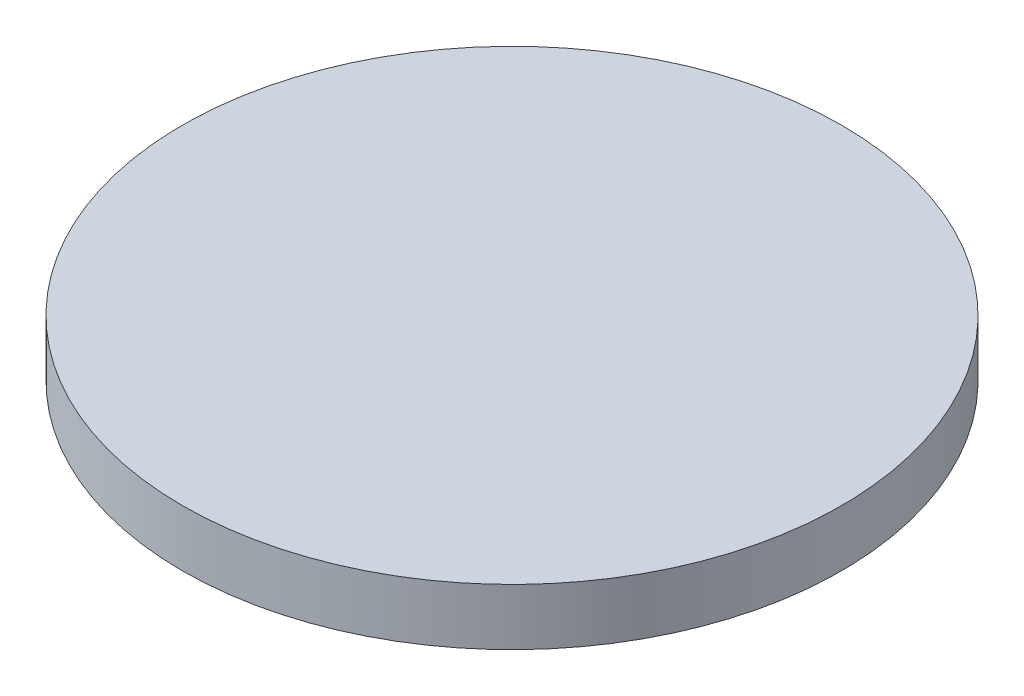
ISO-10303-21;
HEADER;
FILE_DESCRIPTION(('STEP AP214'),'2;1');
FILE_NAME('part.step','',(''),(''),'','','');
FILE_SCHEMA(('AUTOMOTIVE_DESIGN { 1 0 10303 214 1 1 1 1 }'));
ENDSEC;
DATA;
#1=APPLICATION_CONTEXT('core data for automotive mechanical design processes');
#2=APPLICATION_PROTOCOL_DEFINITION('international standard','automotive_design',2000,#1);
#3=PRODUCT_CONTEXT('',#1,'mechanical');
#4=PRODUCT('Part','Part','',(#3));
#5=PRODUCT_RELATED_PRODUCT_CATEGORY('part','',(#4));
#6=PRODUCT_DEFINITION_FORMATION('','',#4);
#7=PRODUCT_DEFINITION_CONTEXT('part definition',#1,'design');
#8=PRODUCT_DEFINITION('design','',#6,#7);
#9=PRODUCT_DEFINITION_SHAPE('','',#8);
#10=(LENGTH_UNIT() NAMED_UNIT(*) SI_UNIT(.MILLI.,.METRE.));
#11=(NAMED_UNIT(*) PLANE_ANGLE_UNIT() SI_UNIT($,.RADIAN.));
#12=(NAMED_UNIT(*) SI_UNIT($,.STERADIAN.) SOLID_ANGLE_UNIT());
#13=UNCERTAINTY_MEASURE_WITH_UNIT(LENGTH_MEASURE(1.E-05),#10,'distance_accuracy_value','');
#14=(GEOMETRIC_REPRESENTATION_CONTEXT(3) GLOBAL_UNCERTAINTY_ASSIGNED_CONTEXT((#13)) GLOBAL_UNIT_ASSIGNED_CONTEXT((#10,
#11,#12)) REPRESENTATION_CONTEXT('',''));
#15=CARTESIAN_POINT('',(0.,0.,0.));
#16=DIRECTION('',(0.,0.,1.));
#17=DIRECTION('',(1.,0.,0.));
#18=AXIS2_PLACEMENT_3D('',#15,#16,#17);
#19=CARTESIAN_POINT('',(0.,0.762,0.));
#20=DIRECTION('',(0.,-1.,0.));
#21=DIRECTION('',(0.,0.,-1.));
#22=AXIS2_PLACEMENT_3D('',#19,#20,#21);
#23=CYLINDRICAL_SURFACE('',#22,4.445);
#24=CARTESIAN_POINT('',(0.,0.762,0.));
#25=DIRECTION('',(0.,1.,0.));
#26=DIRECTION('',(0.,0.,1.));
#27=AXIS2_PLACEMENT_3D('',#24,#25,#26);
#28=CIRCLE('',#27,4.445);
#29=CARTESIAN_POINT('',(0.,0.762,-4.445));
#30=VERTEX_POINT('',#29);
#31=EDGE_CURVE('E10',#30,#30,#28,.T.);
#32=CARTESIAN_POINT('',(0.,0.,0.));
#33=DIRECTION('',(0.,1.,0.));
#34=DIRECTION('',(0.,0.,1.));
#35=AXIS2_PLACEMENT_3D('',#32,#33,#34);
#36=CIRCLE('',#35,4.445);
#37=CARTESIAN_POINT('',(0.,0.,-4.445));
#38=VERTEX_POINT('',#37);
#39=EDGE_CURVE('E34',#38,#38,#36,.T.);
#40=CARTESIAN_POINT('',(0.,0.762,-4.445));
#41=CARTESIAN_POINT('',(0.,0.7540625,-4.445));
#42=CARTESIAN_POINT('',(0.,0.746125,-4.445));
#43=CARTESIAN_POINT('',(0.,0.73025,-4.445));
#44=CARTESIAN_POINT('',(0.,0.7223125,-4.445));
#45=CARTESIAN_POINT('',(0.,0.7064375,-4.445));
#46=CARTESIAN_POINT('',(0.,0.6985,-4.445));
#47=CARTESIAN_POINT('',(0.,0.682625,-4.445));
#48=CARTESIAN_POINT('',(0.,0.6746875,-4.445));
#49=CARTESIAN_POINT('',(0.,0.6588125,-4.445));
#50=CARTESIAN_POINT('',(0.,0.650875,-4.445));
#51=CARTESIAN_POINT('',(0.,0.635,-4.445));
#52=CARTESIAN_POINT('',(0.,0.6270625,-4.445));
#53=CARTESIAN_POINT('',(0.,0.6111875,-4.445));
#54=CARTESIAN_POINT('',(0.,0.60325,-4.445));
#55=CARTESIAN_POINT('',(0.,0.587375,-4.445));
#56=CARTESIAN_POINT('',(0.,0.5794375,-4.445));
#57=CARTESIAN_POINT('',(0.,0.5635625,-4.445));
#58=CARTESIAN_POINT('',(0.,0.555625,-4.445));
#59=CARTESIAN_POINT('',(0.,0.53975,-4.445));
#60=CARTESIAN_POINT('',(0.,0.5318125,-4.445));
#61=CARTESIAN_POINT('',(0.,0.5159375,-4.445));
#62=CARTESIAN_POINT('',(0.,0.508,-4.445));
#63=CARTESIAN_POINT('',(0.,0.492125,-4.445));
#64=CARTESIAN_POINT('',(0.,0.4841875,-4.445));
#65=CARTESIAN_POINT('',(0.,0.4683125,-4.445));
#66=CARTESIAN_POINT('',(0.,0.460375,-4.445));
#67=CARTESIAN_POINT('',(0.,0.4445,-4.445));
#68=CARTESIAN_POINT('',(0.,0.4365625,-4.445));
#69=CARTESIAN_POINT('',(0.,0.4206875,-4.445));
#70=CARTESIAN_POINT('',(0.,0.41275,-4.445));
#71=CARTESIAN_POINT('',(0.,0.396875,-4.445));
#72=CARTESIAN_POINT('',(0.,0.3889375,-4.445));
#73=CARTESIAN_POINT('',(0.,0.3730625,-4.445));
#74=CARTESIAN_POINT('',(0.,0.365125,-4.445));
#75=CARTESIAN_POINT('',(0.,0.34925,-4.445));
#76=CARTESIAN_POINT('',(0.,0.3413125,-4.445));
#77=CARTESIAN_POINT('',(0.,0.3254375,-4.445));
#78=CARTESIAN_POINT('',(0.,0.3175,-4.445));
#79=CARTESIAN_POINT('',(0.,0.301625,-4.445));
#80=CARTESIAN_POINT('',(0.,0.2936875,-4.445));
#81=CARTESIAN_POINT('',(0.,0.2778125,-4.445));
#82=CARTESIAN_POINT('',(0.,0.269875,-4.445));
#83=CARTESIAN_POINT('',(0.,0.254,-4.445));
#84=CARTESIAN_POINT('',(0.,0.2460625,-4.445));
#85=CARTESIAN_POINT('',(0.,0.2301875,-4.445));
#86=CARTESIAN_POINT('',(0.,0.22225,-4.445));
#87=CARTESIAN_POINT('',(0.,0.206375,-4.445));
#88=CARTESIAN_POINT('',(0.,0.1984375,-4.445));
#89=CARTESIAN_POINT('',(0.,0.1825625,-4.445));
#90=CARTESIAN_POINT('',(0.,0.174625,-4.445));
#91=CARTESIAN_POINT('',(0.,0.15875,-4.445));
#92=CARTESIAN_POINT('',(0.,0.1508125,-4.445));
#93=CARTESIAN_POINT('',(0.,0.1349375,-4.445));
#94=CARTESIAN_POINT('',(0.,0.127,-4.445));
#95=CARTESIAN_POINT('',(0.,0.111125,-4.445));
#96=CARTESIAN_POINT('',(0.,0.1031875,-4.445));
#97=CARTESIAN_POINT('',(0.,0.0873125,-4.445));
#98=CARTESIAN_POINT('',(0.,0.079375,-4.445));
#99=CARTESIAN_POINT('',(0.,0.0635,-4.445));
#100=CARTESIAN_POINT('',(0.,0.0555625,-4.445));
#101=CARTESIAN_POINT('',(0.,0.0396875,-4.445));
#102=CARTESIAN_POINT('',(0.,0.03175,-4.445));
#103=CARTESIAN_POINT('',(0.,0.015875,-4.445));
#104=CARTESIAN_POINT('',(0.,0.00793749999999999,-4.445));
#105=CARTESIAN_POINT('',(0.,0.,-4.445));
#106=B_SPLINE_CURVE_WITH_KNOTS('',3,(#40,#41,#42,#43,#44,#45,#46,#47,#48,#49,#50,#51,#52,#53,
#54,#55,#56,#57,#58,#59,#60,#61,#62,#63,#64,#65,#66,#67,#68,#69,#70,#71,#72,#73,#74,#75,#76,#77,
#78,#79,#80,#81,#82,#83,#84,#85,#86,#87,#88,#89,#90,#91,#92,#93,#94,#95,#96,#97,#98,#99,#100,
#101,#102,#103,#104,#105),.UNSPECIFIED.,.F.,.F.,(4,2,2,2,2,2,2,2,2,2,2,2,2,2,2,2,2,2,2,2,2,2,2,
2,2,2,2,2,2,2,2,2,4),(0.,0.0238125,0.0476249999999999,0.0714374999999999,0.09525,0.1190625,
0.142875,0.1666875,0.1905,0.2143125,0.238125,0.2619375,0.28575,0.3095625,0.333375,0.3571875,
0.381,0.4048125,0.428625,0.4524375,0.47625,0.5000625,0.523875,0.5476875,0.5715,0.5953125,
0.619125,0.6429375,0.66675,0.6905625,0.714375,0.7381875,0.762),.UNSPECIFIED.);
#107=EDGE_CURVE('BSEAM31',#30,#38,#106,.T.);
#108=ORIENTED_EDGE('',*,*,#31,.F.);
#109=ORIENTED_EDGE('',*,*,#39,.T.);
#110=ORIENTED_EDGE('',*,*,#107,.T.);
#111=ORIENTED_EDGE('',*,*,#107,.F.);
#112=EDGE_LOOP('',(#108,#110,#109,#111));
#113=FACE_BOUND('',#112,.T.);
#114=ADVANCED_FACE('F31',(#113),#23,.T.);
#115=CARTESIAN_POINT('',(0.,0.762,0.));
#116=DIRECTION('',(0.,1.,0.));
#117=DIRECTION('',(0.,0.,1.));
#118=AXIS2_PLACEMENT_3D('',#115,#116,#117);
#119=PLANE('',#118);
#120=ORIENTED_EDGE('',*,*,#31,.T.);
#121=EDGE_LOOP('',(#120));
#122=FACE_BOUND('',#121,.T.);
#123=ADVANCED_FACE('F46',(#122),#119,.T.);
#124=CARTESIAN_POINT('',(0.,0.,0.));
#125=DIRECTION('',(0.,1.,0.));
#126=DIRECTION('',(0.,0.,1.));
#127=AXIS2_PLACEMENT_3D('',#124,#125,#126);
#128=PLANE('',#127);
#129=ORIENTED_EDGE('',*,*,#39,.F.);
#130=EDGE_LOOP('',(#129));
#131=FACE_BOUND('',#130,.T.);
#132=ADVANCED_FACE('F44',(#131),#128,.F.);
#133=CLOSED_SHELL('',(#114,#123,#132));
#134=MANIFOLD_SOLID_BREP('B2',#133);
#135=ADVANCED_BREP_SHAPE_REPRESENTATION('',(#18,#134),#14);
#136=SHAPE_DEFINITION_REPRESENTATION(#9,#135);
ENDSEC;
END-ISO-10303-21;
